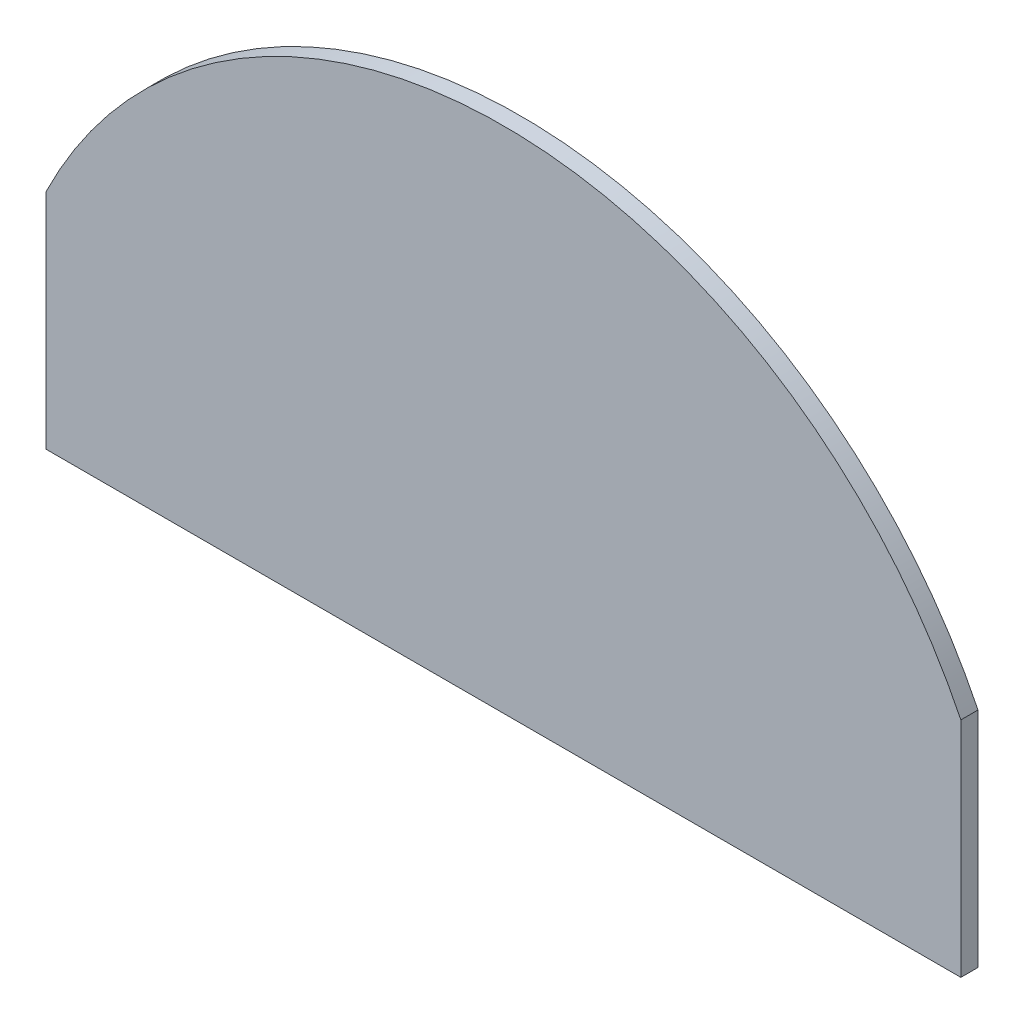
ISO-10303-21;
HEADER;
FILE_DESCRIPTION(('STEP AP214'),'2;1');
FILE_NAME('part.step','',(''),(''),'','','');
FILE_SCHEMA(('AUTOMOTIVE_DESIGN { 1 0 10303 214 1 1 1 1 }'));
ENDSEC;
DATA;
#1=APPLICATION_CONTEXT('core data for automotive mechanical design processes');
#2=APPLICATION_PROTOCOL_DEFINITION('international standard','automotive_design',2000,#1);
#3=PRODUCT_CONTEXT('',#1,'mechanical');
#4=PRODUCT('Part','Part','',(#3));
#5=PRODUCT_RELATED_PRODUCT_CATEGORY('part','',(#4));
#6=PRODUCT_DEFINITION_FORMATION('','',#4);
#7=PRODUCT_DEFINITION_CONTEXT('part definition',#1,'design');
#8=PRODUCT_DEFINITION('design','',#6,#7);
#9=PRODUCT_DEFINITION_SHAPE('','',#8);
#10=(LENGTH_UNIT() NAMED_UNIT(*) SI_UNIT(.MILLI.,.METRE.));
#11=(NAMED_UNIT(*) PLANE_ANGLE_UNIT() SI_UNIT($,.RADIAN.));
#12=(NAMED_UNIT(*) SI_UNIT($,.STERADIAN.) SOLID_ANGLE_UNIT());
#13=UNCERTAINTY_MEASURE_WITH_UNIT(LENGTH_MEASURE(1.E-05),#10,'distance_accuracy_value','');
#14=(GEOMETRIC_REPRESENTATION_CONTEXT(3) GLOBAL_UNCERTAINTY_ASSIGNED_CONTEXT((#13)) GLOBAL_UNIT_ASSIGNED_CONTEXT((#10,
#11,#12)) REPRESENTATION_CONTEXT('',''));
#15=CARTESIAN_POINT('',(0.,0.,0.));
#16=DIRECTION('',(0.,0.,1.));
#17=DIRECTION('',(1.,0.,0.));
#18=AXIS2_PLACEMENT_3D('',#15,#16,#17);
#19=CARTESIAN_POINT('',(0.,0.,3.));
#20=DIRECTION('',(1.,0.,0.));
#21=DIRECTION('',(0.,1.,0.));
#22=AXIS2_PLACEMENT_3D('',#19,#20,#21);
#23=PLANE('',#22);
#24=DIRECTION('',(0.,-1.,0.));
#25=VECTOR('',#24,1.);
#26=CARTESIAN_POINT('',(0.,0.,0.));
#27=LINE('',#26,#25);
#28=CARTESIAN_POINT('',(0.,0.,0.));
#29=VERTEX_POINT('',#28);
#30=CARTESIAN_POINT('',(0.,-39.,0.));
#31=VERTEX_POINT('',#30);
#32=EDGE_CURVE('E96',#29,#31,#27,.T.);
#33=ORIENTED_EDGE('',*,*,#32,.T.);
#34=DIRECTION('',(0.,0.,-1.));
#35=VECTOR('',#34,1.);
#36=CARTESIAN_POINT('',(0.,-39.,3.));
#37=LINE('',#36,#35);
#38=CARTESIAN_POINT('',(0.,-39.,3.));
#39=VERTEX_POINT('',#38);
#40=EDGE_CURVE('E11',#39,#31,#37,.T.);
#41=ORIENTED_EDGE('',*,*,#40,.F.);
#42=DIRECTION('',(0.,-1.,0.));
#43=VECTOR('',#42,1.);
#44=CARTESIAN_POINT('',(0.,0.,3.));
#45=LINE('',#44,#43);
#46=CARTESIAN_POINT('',(0.,0.,3.));
#47=VERTEX_POINT('',#46);
#48=EDGE_CURVE('E82',#47,#39,#45,.T.);
#49=ORIENTED_EDGE('',*,*,#48,.F.);
#50=DIRECTION('',(0.,0.,-1.));
#51=VECTOR('',#50,1.);
#52=CARTESIAN_POINT('',(0.,0.,3.));
#53=LINE('',#52,#51);
#54=EDGE_CURVE('E49',#47,#29,#53,.T.);
#55=ORIENTED_EDGE('',*,*,#54,.T.);
#56=EDGE_LOOP('',(#33,#41,#49,#55));
#57=FACE_BOUND('',#56,.T.);
#58=ADVANCED_FACE('F33',(#57),#23,.F.);
#59=CARTESIAN_POINT('',(0.,-39.,3.));
#60=DIRECTION('',(0.,1.,0.));
#61=DIRECTION('',(0.,0.,1.));
#62=AXIS2_PLACEMENT_3D('',#59,#60,#61);
#63=PLANE('',#62);
#64=DIRECTION('',(1.,0.,0.));
#65=VECTOR('',#64,1.);
#66=CARTESIAN_POINT('',(0.,-39.,0.));
#67=LINE('',#66,#65);
#68=CARTESIAN_POINT('',(160.,-39.,0.));
#69=VERTEX_POINT('',#68);
#70=EDGE_CURVE('E87',#31,#69,#67,.T.);
#71=ORIENTED_EDGE('',*,*,#70,.T.);
#72=DIRECTION('',(0.,0.,-1.));
#73=VECTOR('',#72,1.);
#74=CARTESIAN_POINT('',(160.,-39.,3.));
#75=LINE('',#74,#73);
#76=CARTESIAN_POINT('',(160.,-39.,3.));
#77=VERTEX_POINT('',#76);
#78=EDGE_CURVE('E41',#77,#69,#75,.T.);
#79=ORIENTED_EDGE('',*,*,#78,.F.);
#80=DIRECTION('',(1.,0.,0.));
#81=VECTOR('',#80,1.);
#82=CARTESIAN_POINT('',(0.,-39.,3.));
#83=LINE('',#82,#81);
#84=EDGE_CURVE('E74',#39,#77,#83,.T.);
#85=ORIENTED_EDGE('',*,*,#84,.F.);
#86=ORIENTED_EDGE('',*,*,#40,.T.);
#87=EDGE_LOOP('',(#71,#79,#85,#86));
#88=FACE_BOUND('',#87,.T.);
#89=ADVANCED_FACE('F86',(#88),#63,.F.);
#90=CARTESIAN_POINT('',(160.,0.,3.));
#91=DIRECTION('',(1.,0.,0.));
#92=DIRECTION('',(0.,0.,-1.));
#93=AXIS2_PLACEMENT_3D('',#90,#91,#92);
#94=PLANE('',#93);
#95=DIRECTION('',(0.,-1.,0.));
#96=VECTOR('',#95,1.);
#97=CARTESIAN_POINT('',(160.,0.,0.));
#98=LINE('',#97,#96);
#99=CARTESIAN_POINT('',(160.,0.,0.));
#100=VERTEX_POINT('',#99);
#101=EDGE_CURVE('E99',#100,#69,#98,.T.);
#102=ORIENTED_EDGE('',*,*,#101,.F.);
#103=DIRECTION('',(0.,0.,-1.));
#104=VECTOR('',#103,1.);
#105=CARTESIAN_POINT('',(160.,0.,3.));
#106=LINE('',#105,#104);
#107=CARTESIAN_POINT('',(160.,0.,3.));
#108=VERTEX_POINT('',#107);
#109=EDGE_CURVE('E63',#108,#100,#106,.T.);
#110=ORIENTED_EDGE('',*,*,#109,.F.);
#111=DIRECTION('',(0.,-1.,0.));
#112=VECTOR('',#111,1.);
#113=CARTESIAN_POINT('',(160.,0.,3.));
#114=LINE('',#113,#112);
#115=EDGE_CURVE('E81',#108,#77,#114,.T.);
#116=ORIENTED_EDGE('',*,*,#115,.T.);
#117=ORIENTED_EDGE('',*,*,#78,.T.);
#118=EDGE_LOOP('',(#102,#110,#116,#117));
#119=FACE_BOUND('',#118,.T.);
#120=ADVANCED_FACE('F90',(#119),#94,.T.);
#121=CARTESIAN_POINT('',(80.,-39.,3.));
#122=DIRECTION('',(0.,0.,-1.));
#123=DIRECTION('',(-1.,0.,0.));
#124=AXIS2_PLACEMENT_3D('',#121,#122,#123);
#125=CYLINDRICAL_SURFACE('',#124,89.);
#126=CARTESIAN_POINT('',(80.,-39.,0.));
#127=DIRECTION('',(0.,0.,-1.));
#128=DIRECTION('',(-1.,0.,0.));
#129=AXIS2_PLACEMENT_3D('',#126,#127,#128);
#130=CIRCLE('',#129,89.);
#131=EDGE_CURVE('E101',#29,#100,#130,.T.);
#132=ORIENTED_EDGE('',*,*,#131,.F.);
#133=ORIENTED_EDGE('',*,*,#54,.F.);
#134=CARTESIAN_POINT('',(80.,-39.,3.));
#135=DIRECTION('',(0.,0.,-1.));
#136=DIRECTION('',(-1.,0.,0.));
#137=AXIS2_PLACEMENT_3D('',#134,#135,#136);
#138=CIRCLE('',#137,89.);
#139=EDGE_CURVE('E91',#47,#108,#138,.T.);
#140=ORIENTED_EDGE('',*,*,#139,.T.);
#141=ORIENTED_EDGE('',*,*,#109,.T.);
#142=EDGE_LOOP('',(#132,#133,#140,#141));
#143=FACE_BOUND('',#142,.T.);
#144=ADVANCED_FACE('F107',(#143),#125,.T.);
#145=CARTESIAN_POINT('',(80.,-39.,3.));
#146=DIRECTION('',(0.,0.,-1.));
#147=DIRECTION('',(-1.,0.,0.));
#148=AXIS2_PLACEMENT_3D('',#145,#146,#147);
#149=PLANE('',#148);
#150=ORIENTED_EDGE('',*,*,#48,.T.);
#151=ORIENTED_EDGE('',*,*,#84,.T.);
#152=ORIENTED_EDGE('',*,*,#115,.F.);
#153=ORIENTED_EDGE('',*,*,#139,.F.);
#154=EDGE_LOOP('',(#150,#151,#152,#153));
#155=FACE_BOUND('',#154,.T.);
#156=ADVANCED_FACE('F78',(#155),#149,.F.);
#157=CARTESIAN_POINT('',(80.,-39.,0.));
#158=DIRECTION('',(0.,0.,-1.));
#159=DIRECTION('',(-1.,0.,0.));
#160=AXIS2_PLACEMENT_3D('',#157,#158,#159);
#161=PLANE('',#160);
#162=ORIENTED_EDGE('',*,*,#32,.F.);
#163=ORIENTED_EDGE('',*,*,#131,.T.);
#164=ORIENTED_EDGE('',*,*,#101,.T.);
#165=ORIENTED_EDGE('',*,*,#70,.F.);
#166=EDGE_LOOP('',(#162,#163,#164,#165));
#167=FACE_BOUND('',#166,.T.);
#168=ADVANCED_FACE('F106',(#167),#161,.T.);
#169=CLOSED_SHELL('',(#58,#89,#120,#144,#156,#168));
#170=MANIFOLD_SOLID_BREP('B2',#169);
#171=ADVANCED_BREP_SHAPE_REPRESENTATION('',(#18,#170),#14);
#172=SHAPE_DEFINITION_REPRESENTATION(#9,#171);
ENDSEC;
END-ISO-10303-21;
